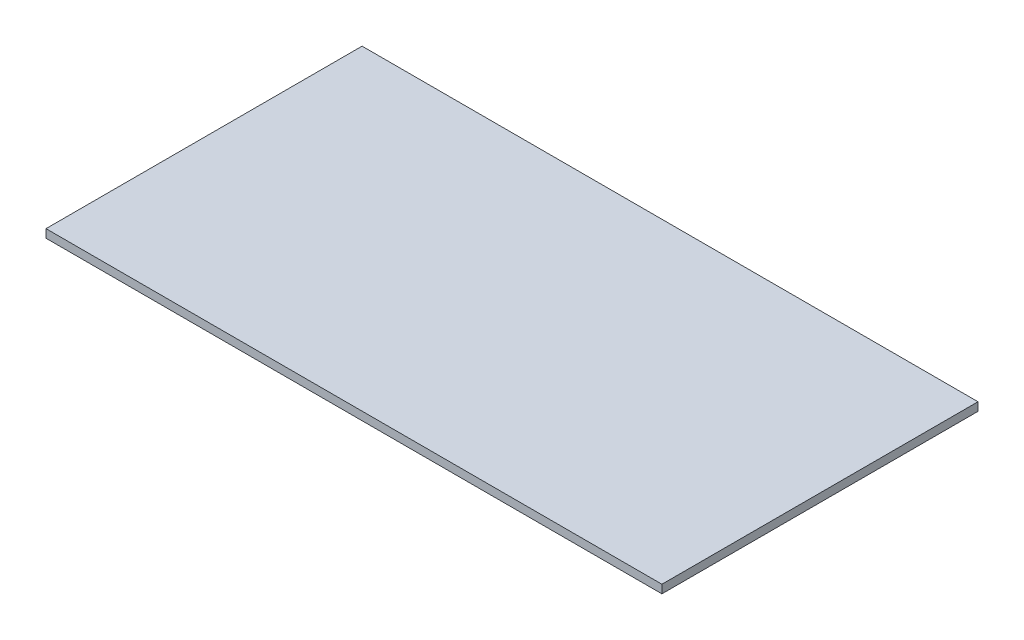
ISO-10303-21;
HEADER;
FILE_DESCRIPTION(('STEP AP214'),'2;1');
FILE_NAME('part.step','',(''),(''),'','','');
FILE_SCHEMA(('AUTOMOTIVE_DESIGN { 1 0 10303 214 1 1 1 1 }'));
ENDSEC;
DATA;
#1=APPLICATION_CONTEXT('core data for automotive mechanical design processes');
#2=APPLICATION_PROTOCOL_DEFINITION('international standard','automotive_design',2000,#1);
#3=PRODUCT_CONTEXT('',#1,'mechanical');
#4=PRODUCT('Part','Part','',(#3));
#5=PRODUCT_RELATED_PRODUCT_CATEGORY('part','',(#4));
#6=PRODUCT_DEFINITION_FORMATION('','',#4);
#7=PRODUCT_DEFINITION_CONTEXT('part definition',#1,'design');
#8=PRODUCT_DEFINITION('design','',#6,#7);
#9=PRODUCT_DEFINITION_SHAPE('','',#8);
#10=(LENGTH_UNIT() NAMED_UNIT(*) SI_UNIT(.MILLI.,.METRE.));
#11=(NAMED_UNIT(*) PLANE_ANGLE_UNIT() SI_UNIT($,.RADIAN.));
#12=(NAMED_UNIT(*) SI_UNIT($,.STERADIAN.) SOLID_ANGLE_UNIT());
#13=UNCERTAINTY_MEASURE_WITH_UNIT(LENGTH_MEASURE(1.E-05),#10,'distance_accuracy_value','');
#14=(GEOMETRIC_REPRESENTATION_CONTEXT(3) GLOBAL_UNCERTAINTY_ASSIGNED_CONTEXT((#13)) GLOBAL_UNIT_ASSIGNED_CONTEXT((#10,
#11,#12)) REPRESENTATION_CONTEXT('',''));
#15=CARTESIAN_POINT('',(0.,0.,0.));
#16=DIRECTION('',(0.,0.,1.));
#17=DIRECTION('',(1.,0.,0.));
#18=AXIS2_PLACEMENT_3D('',#15,#16,#17);
#19=CARTESIAN_POINT('',(73.85,2.,-37.9));
#20=DIRECTION('',(-1.,0.,0.));
#21=DIRECTION('',(0.,0.,1.));
#22=AXIS2_PLACEMENT_3D('',#19,#20,#21);
#23=PLANE('',#22);
#24=DIRECTION('',(0.,0.,-1.));
#25=VECTOR('',#24,1.);
#26=CARTESIAN_POINT('',(73.85,0.,-37.9));
#27=LINE('',#26,#25);
#28=CARTESIAN_POINT('',(73.85,0.,37.9));
#29=VERTEX_POINT('',#28);
#30=CARTESIAN_POINT('',(73.85,0.,-37.9));
#31=VERTEX_POINT('',#30);
#32=EDGE_CURVE('E96',#29,#31,#27,.T.);
#33=ORIENTED_EDGE('',*,*,#32,.T.);
#34=DIRECTION('',(0.,-1.,0.));
#35=VECTOR('',#34,1.);
#36=CARTESIAN_POINT('',(73.85,2.,-37.9));
#37=LINE('',#36,#35);
#38=CARTESIAN_POINT('',(73.85,2.,-37.9));
#39=VERTEX_POINT('',#38);
#40=EDGE_CURVE('E11',#39,#31,#37,.T.);
#41=ORIENTED_EDGE('',*,*,#40,.F.);
#42=DIRECTION('',(0.,0.,-1.));
#43=VECTOR('',#42,1.);
#44=CARTESIAN_POINT('',(73.85,2.,-37.9));
#45=LINE('',#44,#43);
#46=CARTESIAN_POINT('',(73.85,2.,37.9));
#47=VERTEX_POINT('',#46);
#48=EDGE_CURVE('E84',#47,#39,#45,.T.);
#49=ORIENTED_EDGE('',*,*,#48,.F.);
#50=DIRECTION('',(0.,-1.,0.));
#51=VECTOR('',#50,1.);
#52=CARTESIAN_POINT('',(73.85,2.,37.9));
#53=LINE('',#52,#51);
#54=EDGE_CURVE('E92',#47,#29,#53,.T.);
#55=ORIENTED_EDGE('',*,*,#54,.T.);
#56=EDGE_LOOP('',(#33,#41,#49,#55));
#57=FACE_BOUND('',#56,.T.);
#58=ADVANCED_FACE('F33',(#57),#23,.F.);
#59=CARTESIAN_POINT('',(-73.85,2.,-37.9));
#60=DIRECTION('',(0.,0.,1.));
#61=DIRECTION('',(1.,0.,0.));
#62=AXIS2_PLACEMENT_3D('',#59,#60,#61);
#63=PLANE('',#62);
#64=DIRECTION('',(-1.,0.,0.));
#65=VECTOR('',#64,1.);
#66=CARTESIAN_POINT('',(-73.85,0.,-37.9));
#67=LINE('',#66,#65);
#68=CARTESIAN_POINT('',(-73.85,0.,-37.9));
#69=VERTEX_POINT('',#68);
#70=EDGE_CURVE('E88',#31,#69,#67,.T.);
#71=ORIENTED_EDGE('',*,*,#70,.T.);
#72=DIRECTION('',(0.,-1.,0.));
#73=VECTOR('',#72,1.);
#74=CARTESIAN_POINT('',(-73.85,2.,-37.9));
#75=LINE('',#74,#73);
#76=CARTESIAN_POINT('',(-73.85,2.,-37.9));
#77=VERTEX_POINT('',#76);
#78=EDGE_CURVE('E41',#77,#69,#75,.T.);
#79=ORIENTED_EDGE('',*,*,#78,.F.);
#80=DIRECTION('',(-1.,0.,0.));
#81=VECTOR('',#80,1.);
#82=CARTESIAN_POINT('',(-73.85,2.,-37.9));
#83=LINE('',#82,#81);
#84=EDGE_CURVE('E79',#39,#77,#83,.T.);
#85=ORIENTED_EDGE('',*,*,#84,.F.);
#86=ORIENTED_EDGE('',*,*,#40,.T.);
#87=EDGE_LOOP('',(#71,#79,#85,#86));
#88=FACE_BOUND('',#87,.T.);
#89=ADVANCED_FACE('F87',(#88),#63,.F.);
#90=CARTESIAN_POINT('',(-73.85,2.,-37.9));
#91=DIRECTION('',(1.,0.,0.));
#92=DIRECTION('',(0.,0.,-1.));
#93=AXIS2_PLACEMENT_3D('',#90,#91,#92);
#94=PLANE('',#93);
#95=DIRECTION('',(0.,0.,1.));
#96=VECTOR('',#95,1.);
#97=CARTESIAN_POINT('',(-73.85,0.,-37.9));
#98=LINE('',#97,#96);
#99=CARTESIAN_POINT('',(-73.85,0.,37.9));
#100=VERTEX_POINT('',#99);
#101=EDGE_CURVE('E66',#69,#100,#98,.T.);
#102=ORIENTED_EDGE('',*,*,#101,.T.);
#103=DIRECTION('',(0.,-1.,0.));
#104=VECTOR('',#103,1.);
#105=CARTESIAN_POINT('',(-73.85,2.,37.9));
#106=LINE('',#105,#104);
#107=CARTESIAN_POINT('',(-73.85,2.,37.9));
#108=VERTEX_POINT('',#107);
#109=EDGE_CURVE('E89',#108,#100,#106,.T.);
#110=ORIENTED_EDGE('',*,*,#109,.F.);
#111=DIRECTION('',(0.,0.,1.));
#112=VECTOR('',#111,1.);
#113=CARTESIAN_POINT('',(-73.85,2.,-37.9));
#114=LINE('',#113,#112);
#115=EDGE_CURVE('E82',#77,#108,#114,.T.);
#116=ORIENTED_EDGE('',*,*,#115,.F.);
#117=ORIENTED_EDGE('',*,*,#78,.T.);
#118=EDGE_LOOP('',(#102,#110,#116,#117));
#119=FACE_BOUND('',#118,.T.);
#120=ADVANCED_FACE('F90',(#119),#94,.F.);
#121=CARTESIAN_POINT('',(-73.85,2.,37.9));
#122=DIRECTION('',(0.,0.,-1.));
#123=DIRECTION('',(-1.,0.,0.));
#124=AXIS2_PLACEMENT_3D('',#121,#122,#123);
#125=PLANE('',#124);
#126=DIRECTION('',(1.,0.,0.));
#127=VECTOR('',#126,1.);
#128=CARTESIAN_POINT('',(-73.85,0.,37.9));
#129=LINE('',#128,#127);
#130=EDGE_CURVE('E72',#100,#29,#129,.T.);
#131=ORIENTED_EDGE('',*,*,#130,.T.);
#132=ORIENTED_EDGE('',*,*,#54,.F.);
#133=DIRECTION('',(1.,0.,0.));
#134=VECTOR('',#133,1.);
#135=CARTESIAN_POINT('',(-73.85,2.,37.9));
#136=LINE('',#135,#134);
#137=EDGE_CURVE('E49',#108,#47,#136,.T.);
#138=ORIENTED_EDGE('',*,*,#137,.F.);
#139=ORIENTED_EDGE('',*,*,#109,.T.);
#140=EDGE_LOOP('',(#131,#132,#138,#139));
#141=FACE_BOUND('',#140,.T.);
#142=ADVANCED_FACE('F103',(#141),#125,.F.);
#143=CARTESIAN_POINT('',(0.,2.,0.));
#144=DIRECTION('',(0.,1.,0.));
#145=DIRECTION('',(0.,0.,1.));
#146=AXIS2_PLACEMENT_3D('',#143,#144,#145);
#147=PLANE('',#146);
#148=ORIENTED_EDGE('',*,*,#48,.T.);
#149=ORIENTED_EDGE('',*,*,#84,.T.);
#150=ORIENTED_EDGE('',*,*,#115,.T.);
#151=ORIENTED_EDGE('',*,*,#137,.T.);
#152=EDGE_LOOP('',(#148,#149,#150,#151));
#153=FACE_BOUND('',#152,.T.);
#154=ADVANCED_FACE('F80',(#153),#147,.T.);
#155=CARTESIAN_POINT('',(0.,0.,0.));
#156=DIRECTION('',(0.,1.,0.));
#157=DIRECTION('',(0.,0.,1.));
#158=AXIS2_PLACEMENT_3D('',#155,#156,#157);
#159=PLANE('',#158);
#160=ORIENTED_EDGE('',*,*,#32,.F.);
#161=ORIENTED_EDGE('',*,*,#130,.F.);
#162=ORIENTED_EDGE('',*,*,#101,.F.);
#163=ORIENTED_EDGE('',*,*,#70,.F.);
#164=EDGE_LOOP('',(#160,#161,#162,#163));
#165=FACE_BOUND('',#164,.T.);
#166=ADVANCED_FACE('F106',(#165),#159,.F.);
#167=CLOSED_SHELL('',(#58,#89,#120,#142,#154,#166));
#168=MANIFOLD_SOLID_BREP('B2',#167);
#169=ADVANCED_BREP_SHAPE_REPRESENTATION('',(#18,#168),#14);
#170=SHAPE_DEFINITION_REPRESENTATION(#9,#169);
ENDSEC;
END-ISO-10303-21;
